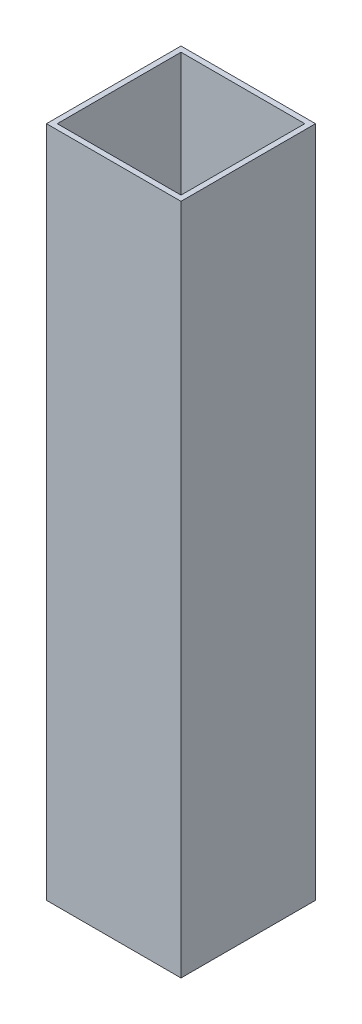
ISO-10303-21;
HEADER;
FILE_DESCRIPTION(('STEP AP214'),'2;1');
FILE_NAME('part.step','',(''),(''),'','','');
FILE_SCHEMA(('AUTOMOTIVE_DESIGN { 1 0 10303 214 1 1 1 1 }'));
ENDSEC;
DATA;
#1=APPLICATION_CONTEXT('core data for automotive mechanical design processes');
#2=APPLICATION_PROTOCOL_DEFINITION('international standard','automotive_design',2000,#1);
#3=PRODUCT_CONTEXT('',#1,'mechanical');
#4=PRODUCT('Part','Part','',(#3));
#5=PRODUCT_RELATED_PRODUCT_CATEGORY('part','',(#4));
#6=PRODUCT_DEFINITION_FORMATION('','',#4);
#7=PRODUCT_DEFINITION_CONTEXT('part definition',#1,'design');
#8=PRODUCT_DEFINITION('design','',#6,#7);
#9=PRODUCT_DEFINITION_SHAPE('','',#8);
#10=(LENGTH_UNIT() NAMED_UNIT(*) SI_UNIT(.MILLI.,.METRE.));
#11=(NAMED_UNIT(*) PLANE_ANGLE_UNIT() SI_UNIT($,.RADIAN.));
#12=(NAMED_UNIT(*) SI_UNIT($,.STERADIAN.) SOLID_ANGLE_UNIT());
#13=UNCERTAINTY_MEASURE_WITH_UNIT(LENGTH_MEASURE(1.E-05),#10,'distance_accuracy_value','');
#14=(GEOMETRIC_REPRESENTATION_CONTEXT(3) GLOBAL_UNCERTAINTY_ASSIGNED_CONTEXT((#13)) GLOBAL_UNIT_ASSIGNED_CONTEXT((#10,
#11,#12)) REPRESENTATION_CONTEXT('',''));
#15=CARTESIAN_POINT('',(0.,0.,0.));
#16=DIRECTION('',(0.,0.,1.));
#17=DIRECTION('',(1.,0.,0.));
#18=AXIS2_PLACEMENT_3D('',#15,#16,#17);
#19=CARTESIAN_POINT('',(23.,250.,23.));
#20=DIRECTION('',(-1.,0.,0.));
#21=DIRECTION('',(0.,0.,1.));
#22=AXIS2_PLACEMENT_3D('',#19,#20,#21);
#23=PLANE('',#22);
#24=DIRECTION('',(0.,0.,-1.));
#25=VECTOR('',#24,1.);
#26=CARTESIAN_POINT('',(23.,0.,23.));
#27=LINE('',#26,#25);
#28=CARTESIAN_POINT('',(23.,0.,23.));
#29=VERTEX_POINT('',#28);
#30=CARTESIAN_POINT('',(23.,0.,-23.));
#31=VERTEX_POINT('',#30);
#32=EDGE_CURVE('E176',#29,#31,#27,.T.);
#33=ORIENTED_EDGE('',*,*,#32,.F.);
#34=DIRECTION('',(0.,-1.,0.));
#35=VECTOR('',#34,1.);
#36=CARTESIAN_POINT('',(23.,250.,23.));
#37=LINE('',#36,#35);
#38=CARTESIAN_POINT('',(23.,250.,23.));
#39=VERTEX_POINT('',#38);
#40=EDGE_CURVE('E12',#39,#29,#37,.T.);
#41=ORIENTED_EDGE('',*,*,#40,.F.);
#42=DIRECTION('',(0.,0.,-1.));
#43=VECTOR('',#42,1.);
#44=CARTESIAN_POINT('',(23.,250.,23.));
#45=LINE('',#44,#43);
#46=CARTESIAN_POINT('',(23.,250.,-23.));
#47=VERTEX_POINT('',#46);
#48=EDGE_CURVE('E151',#39,#47,#45,.T.);
#49=ORIENTED_EDGE('',*,*,#48,.T.);
#50=DIRECTION('',(0.,-1.,0.));
#51=VECTOR('',#50,1.);
#52=CARTESIAN_POINT('',(23.,250.,-23.));
#53=LINE('',#52,#51);
#54=EDGE_CURVE('E81',#47,#31,#53,.T.);
#55=ORIENTED_EDGE('',*,*,#54,.T.);
#56=EDGE_LOOP('',(#33,#41,#49,#55));
#57=FACE_BOUND('',#56,.T.);
#58=ADVANCED_FACE('F61',(#57),#23,.T.);
#59=CARTESIAN_POINT('',(-23.,250.,23.));
#60=DIRECTION('',(0.,0.,-1.));
#61=DIRECTION('',(-1.,0.,0.));
#62=AXIS2_PLACEMENT_3D('',#59,#60,#61);
#63=PLANE('',#62);
#64=DIRECTION('',(1.,0.,0.));
#65=VECTOR('',#64,1.);
#66=CARTESIAN_POINT('',(-23.,0.,23.));
#67=LINE('',#66,#65);
#68=CARTESIAN_POINT('',(-23.,0.,23.));
#69=VERTEX_POINT('',#68);
#70=EDGE_CURVE('E139',#69,#29,#67,.T.);
#71=ORIENTED_EDGE('',*,*,#70,.F.);
#72=DIRECTION('',(0.,-1.,0.));
#73=VECTOR('',#72,1.);
#74=CARTESIAN_POINT('',(-23.,250.,23.));
#75=LINE('',#74,#73);
#76=CARTESIAN_POINT('',(-23.,250.,23.));
#77=VERTEX_POINT('',#76);
#78=EDGE_CURVE('E72',#77,#69,#75,.T.);
#79=ORIENTED_EDGE('',*,*,#78,.F.);
#80=DIRECTION('',(1.,0.,0.));
#81=VECTOR('',#80,1.);
#82=CARTESIAN_POINT('',(-23.,250.,23.));
#83=LINE('',#82,#81);
#84=EDGE_CURVE('E137',#77,#39,#83,.T.);
#85=ORIENTED_EDGE('',*,*,#84,.T.);
#86=ORIENTED_EDGE('',*,*,#40,.T.);
#87=EDGE_LOOP('',(#71,#79,#85,#86));
#88=FACE_BOUND('',#87,.T.);
#89=ADVANCED_FACE('F136',(#88),#63,.T.);
#90=CARTESIAN_POINT('',(-23.,250.,23.));
#91=DIRECTION('',(1.,0.,0.));
#92=DIRECTION('',(0.,0.,-1.));
#93=AXIS2_PLACEMENT_3D('',#90,#91,#92);
#94=PLANE('',#93);
#95=DIRECTION('',(0.,0.,1.));
#96=VECTOR('',#95,1.);
#97=CARTESIAN_POINT('',(-23.,0.,23.));
#98=LINE('',#97,#96);
#99=CARTESIAN_POINT('',(-23.,0.,-23.));
#100=VERTEX_POINT('',#99);
#101=EDGE_CURVE('E181',#100,#69,#98,.T.);
#102=ORIENTED_EDGE('',*,*,#101,.F.);
#103=DIRECTION('',(0.,-1.,0.));
#104=VECTOR('',#103,1.);
#105=CARTESIAN_POINT('',(-23.,250.,-23.));
#106=LINE('',#105,#104);
#107=CARTESIAN_POINT('',(-23.,250.,-23.));
#108=VERTEX_POINT('',#107);
#109=EDGE_CURVE('E106',#108,#100,#106,.T.);
#110=ORIENTED_EDGE('',*,*,#109,.F.);
#111=DIRECTION('',(0.,0.,1.));
#112=VECTOR('',#111,1.);
#113=CARTESIAN_POINT('',(-23.,250.,23.));
#114=LINE('',#113,#112);
#115=EDGE_CURVE('E150',#108,#77,#114,.T.);
#116=ORIENTED_EDGE('',*,*,#115,.T.);
#117=ORIENTED_EDGE('',*,*,#78,.T.);
#118=EDGE_LOOP('',(#102,#110,#116,#117));
#119=FACE_BOUND('',#118,.T.);
#120=ADVANCED_FACE('F154',(#119),#94,.T.);
#121=CARTESIAN_POINT('',(25.,250.,25.));
#122=DIRECTION('',(-1.,0.,0.));
#123=DIRECTION('',(0.,0.,1.));
#124=AXIS2_PLACEMENT_3D('',#121,#122,#123);
#125=PLANE('',#124);
#126=DIRECTION('',(0.,0.,-1.));
#127=VECTOR('',#126,1.);
#128=CARTESIAN_POINT('',(25.,0.,25.));
#129=LINE('',#128,#127);
#130=CARTESIAN_POINT('',(25.,0.,25.));
#131=VERTEX_POINT('',#130);
#132=CARTESIAN_POINT('',(25.,0.,-25.));
#133=VERTEX_POINT('',#132);
#134=EDGE_CURVE('E163',#131,#133,#129,.T.);
#135=ORIENTED_EDGE('',*,*,#134,.T.);
#136=DIRECTION('',(0.,-1.,0.));
#137=VECTOR('',#136,1.);
#138=CARTESIAN_POINT('',(25.,250.,-25.));
#139=LINE('',#138,#137);
#140=CARTESIAN_POINT('',(25.,250.,-25.));
#141=VERTEX_POINT('',#140);
#142=EDGE_CURVE('E65',#141,#133,#139,.T.);
#143=ORIENTED_EDGE('',*,*,#142,.F.);
#144=DIRECTION('',(0.,0.,-1.));
#145=VECTOR('',#144,1.);
#146=CARTESIAN_POINT('',(25.,250.,25.));
#147=LINE('',#146,#145);
#148=CARTESIAN_POINT('',(25.,250.,25.));
#149=VERTEX_POINT('',#148);
#150=EDGE_CURVE('E188',#149,#141,#147,.T.);
#151=ORIENTED_EDGE('',*,*,#150,.F.);
#152=DIRECTION('',(0.,-1.,0.));
#153=VECTOR('',#152,1.);
#154=CARTESIAN_POINT('',(25.,250.,25.));
#155=LINE('',#154,#153);
#156=EDGE_CURVE('E159',#149,#131,#155,.T.);
#157=ORIENTED_EDGE('',*,*,#156,.T.);
#158=EDGE_LOOP('',(#135,#143,#151,#157));
#159=FACE_BOUND('',#158,.T.);
#160=ADVANCED_FACE('F63',(#159),#125,.F.);
#161=CARTESIAN_POINT('',(-25.,250.,-25.));
#162=DIRECTION('',(0.,0.,1.));
#163=DIRECTION('',(1.,0.,0.));
#164=AXIS2_PLACEMENT_3D('',#161,#162,#163);
#165=PLANE('',#164);
#166=DIRECTION('',(-1.,0.,0.));
#167=VECTOR('',#166,1.);
#168=CARTESIAN_POINT('',(-25.,0.,-25.));
#169=LINE('',#168,#167);
#170=CARTESIAN_POINT('',(-25.,0.,-25.));
#171=VERTEX_POINT('',#170);
#172=EDGE_CURVE('E167',#133,#171,#169,.T.);
#173=ORIENTED_EDGE('',*,*,#172,.T.);
#174=DIRECTION('',(0.,-1.,0.));
#175=VECTOR('',#174,1.);
#176=CARTESIAN_POINT('',(-25.,250.,-25.));
#177=LINE('',#176,#175);
#178=CARTESIAN_POINT('',(-25.,250.,-25.));
#179=VERTEX_POINT('',#178);
#180=EDGE_CURVE('E199',#179,#171,#177,.T.);
#181=ORIENTED_EDGE('',*,*,#180,.F.);
#182=DIRECTION('',(-1.,0.,0.));
#183=VECTOR('',#182,1.);
#184=CARTESIAN_POINT('',(-25.,250.,-25.));
#185=LINE('',#184,#183);
#186=EDGE_CURVE('E119',#141,#179,#185,.T.);
#187=ORIENTED_EDGE('',*,*,#186,.F.);
#188=ORIENTED_EDGE('',*,*,#142,.T.);
#189=EDGE_LOOP('',(#173,#181,#187,#188));
#190=FACE_BOUND('',#189,.T.);
#191=ADVANCED_FACE('F207',(#190),#165,.F.);
#192=CARTESIAN_POINT('',(-25.,250.,25.));
#193=DIRECTION('',(1.,0.,0.));
#194=DIRECTION('',(0.,0.,-1.));
#195=AXIS2_PLACEMENT_3D('',#192,#193,#194);
#196=PLANE('',#195);
#197=DIRECTION('',(0.,0.,1.));
#198=VECTOR('',#197,1.);
#199=CARTESIAN_POINT('',(-25.,0.,25.));
#200=LINE('',#199,#198);
#201=CARTESIAN_POINT('',(-25.,0.,25.));
#202=VERTEX_POINT('',#201);
#203=EDGE_CURVE('E170',#171,#202,#200,.T.);
#204=ORIENTED_EDGE('',*,*,#203,.T.);
#205=DIRECTION('',(0.,-1.,0.));
#206=VECTOR('',#205,1.);
#207=CARTESIAN_POINT('',(-25.,250.,25.));
#208=LINE('',#207,#206);
#209=CARTESIAN_POINT('',(-25.,250.,25.));
#210=VERTEX_POINT('',#209);
#211=EDGE_CURVE('E196',#210,#202,#208,.T.);
#212=ORIENTED_EDGE('',*,*,#211,.F.);
#213=DIRECTION('',(0.,0.,1.));
#214=VECTOR('',#213,1.);
#215=CARTESIAN_POINT('',(-25.,250.,25.));
#216=LINE('',#215,#214);
#217=EDGE_CURVE('E224',#179,#210,#216,.T.);
#218=ORIENTED_EDGE('',*,*,#217,.F.);
#219=ORIENTED_EDGE('',*,*,#180,.T.);
#220=EDGE_LOOP('',(#204,#212,#218,#219));
#221=FACE_BOUND('',#220,.T.);
#222=ADVANCED_FACE('F217',(#221),#196,.F.);
#223=CARTESIAN_POINT('',(-25.,250.,25.));
#224=DIRECTION('',(0.,0.,-1.));
#225=DIRECTION('',(-1.,0.,0.));
#226=AXIS2_PLACEMENT_3D('',#223,#224,#225);
#227=PLANE('',#226);
#228=DIRECTION('',(1.,0.,0.));
#229=VECTOR('',#228,1.);
#230=CARTESIAN_POINT('',(-25.,0.,25.));
#231=LINE('',#230,#229);
#232=EDGE_CURVE('E173',#202,#131,#231,.T.);
#233=ORIENTED_EDGE('',*,*,#232,.T.);
#234=ORIENTED_EDGE('',*,*,#156,.F.);
#235=DIRECTION('',(1.,0.,0.));
#236=VECTOR('',#235,1.);
#237=CARTESIAN_POINT('',(-25.,250.,25.));
#238=LINE('',#237,#236);
#239=EDGE_CURVE('E221',#210,#149,#238,.T.);
#240=ORIENTED_EDGE('',*,*,#239,.F.);
#241=ORIENTED_EDGE('',*,*,#211,.T.);
#242=EDGE_LOOP('',(#233,#234,#240,#241));
#243=FACE_BOUND('',#242,.T.);
#244=ADVANCED_FACE('F220',(#243),#227,.F.);
#245=CARTESIAN_POINT('',(-23.,250.,-23.));
#246=DIRECTION('',(0.,0.,1.));
#247=DIRECTION('',(1.,0.,0.));
#248=AXIS2_PLACEMENT_3D('',#245,#246,#247);
#249=PLANE('',#248);
#250=DIRECTION('',(-1.,0.,0.));
#251=VECTOR('',#250,1.);
#252=CARTESIAN_POINT('',(-23.,0.,-23.));
#253=LINE('',#252,#251);
#254=EDGE_CURVE('E184',#31,#100,#253,.T.);
#255=ORIENTED_EDGE('',*,*,#254,.F.);
#256=ORIENTED_EDGE('',*,*,#54,.F.);
#257=DIRECTION('',(-1.,0.,0.));
#258=VECTOR('',#257,1.);
#259=CARTESIAN_POINT('',(-23.,250.,-23.));
#260=LINE('',#259,#258);
#261=EDGE_CURVE('E156',#47,#108,#260,.T.);
#262=ORIENTED_EDGE('',*,*,#261,.T.);
#263=ORIENTED_EDGE('',*,*,#109,.T.);
#264=EDGE_LOOP('',(#255,#256,#262,#263));
#265=FACE_BOUND('',#264,.T.);
#266=ADVANCED_FACE('F234',(#265),#249,.T.);
#267=CARTESIAN_POINT('',(0.,250.,0.));
#268=DIRECTION('',(0.,-1.,0.));
#269=DIRECTION('',(0.,0.,-1.));
#270=AXIS2_PLACEMENT_3D('',#267,#268,#269);
#271=PLANE('',#270);
#272=ORIENTED_EDGE('',*,*,#150,.T.);
#273=ORIENTED_EDGE('',*,*,#186,.T.);
#274=ORIENTED_EDGE('',*,*,#217,.T.);
#275=ORIENTED_EDGE('',*,*,#239,.T.);
#276=EDGE_LOOP('',(#272,#273,#274,#275));
#277=FACE_BOUND('',#276,.T.);
#278=ORIENTED_EDGE('',*,*,#48,.F.);
#279=ORIENTED_EDGE('',*,*,#84,.F.);
#280=ORIENTED_EDGE('',*,*,#115,.F.);
#281=ORIENTED_EDGE('',*,*,#261,.F.);
#282=EDGE_LOOP('',(#278,#279,#280,#281));
#283=FACE_BOUND('',#282,.T.);
#284=ADVANCED_FACE('F148',(#277,#283),#271,.F.);
#285=CARTESIAN_POINT('',(0.,0.,0.));
#286=DIRECTION('',(0.,-1.,0.));
#287=DIRECTION('',(0.,0.,-1.));
#288=AXIS2_PLACEMENT_3D('',#285,#286,#287);
#289=PLANE('',#288);
#290=ORIENTED_EDGE('',*,*,#134,.F.);
#291=ORIENTED_EDGE('',*,*,#232,.F.);
#292=ORIENTED_EDGE('',*,*,#203,.F.);
#293=ORIENTED_EDGE('',*,*,#172,.F.);
#294=EDGE_LOOP('',(#290,#291,#292,#293));
#295=FACE_BOUND('',#294,.T.);
#296=ORIENTED_EDGE('',*,*,#32,.T.);
#297=ORIENTED_EDGE('',*,*,#254,.T.);
#298=ORIENTED_EDGE('',*,*,#101,.T.);
#299=ORIENTED_EDGE('',*,*,#70,.T.);
#300=EDGE_LOOP('',(#296,#297,#298,#299));
#301=FACE_BOUND('',#300,.T.);
#302=ADVANCED_FACE('F214',(#295,#301),#289,.T.);
#303=CLOSED_SHELL('',(#58,#89,#120,#160,#191,#222,#244,#266,#284,#302));
#304=MANIFOLD_SOLID_BREP('B2',#303);
#305=ADVANCED_BREP_SHAPE_REPRESENTATION('',(#18,#304),#14);
#306=SHAPE_DEFINITION_REPRESENTATION(#9,#305);
ENDSEC;
END-ISO-10303-21;
